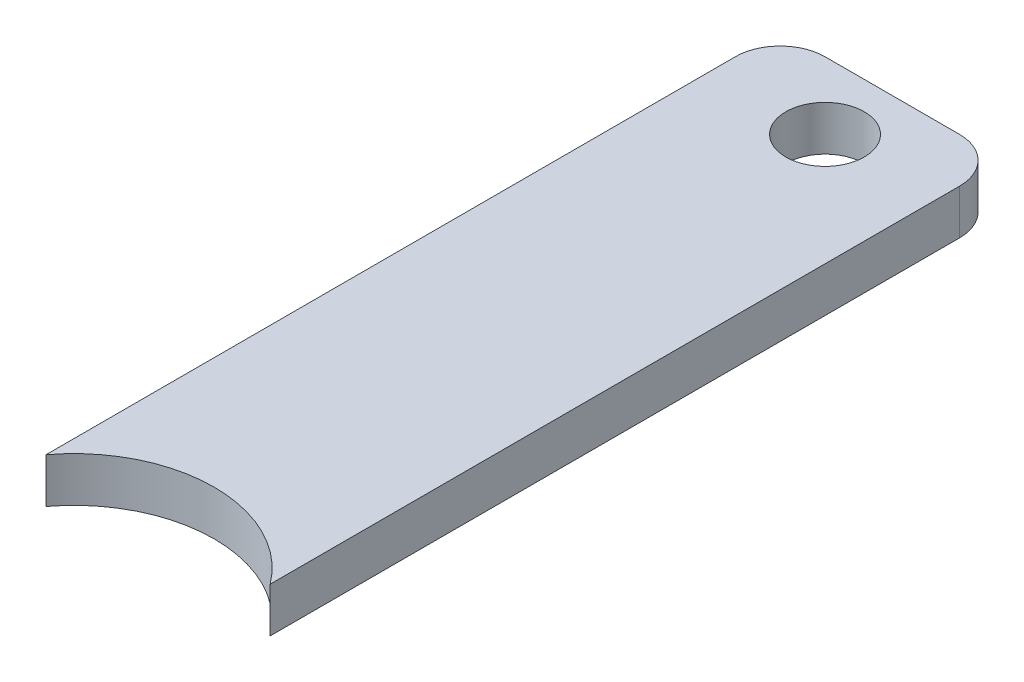
ISO-10303-21;
HEADER;
FILE_DESCRIPTION(('STEP AP214'),'2;1');
FILE_NAME('part.step','',(''),(''),'','','');
FILE_SCHEMA(('AUTOMOTIVE_DESIGN { 1 0 10303 214 1 1 1 1 }'));
ENDSEC;
DATA;
#1=APPLICATION_CONTEXT('core data for automotive mechanical design processes');
#2=APPLICATION_PROTOCOL_DEFINITION('international standard','automotive_design',2000,#1);
#3=PRODUCT_CONTEXT('',#1,'mechanical');
#4=PRODUCT('Part','Part','',(#3));
#5=PRODUCT_RELATED_PRODUCT_CATEGORY('part','',(#4));
#6=PRODUCT_DEFINITION_FORMATION('','',#4);
#7=PRODUCT_DEFINITION_CONTEXT('part definition',#1,'design');
#8=PRODUCT_DEFINITION('design','',#6,#7);
#9=PRODUCT_DEFINITION_SHAPE('','',#8);
#10=(LENGTH_UNIT() NAMED_UNIT(*) SI_UNIT(.MILLI.,.METRE.));
#11=(NAMED_UNIT(*) PLANE_ANGLE_UNIT() SI_UNIT($,.RADIAN.));
#12=(NAMED_UNIT(*) SI_UNIT($,.STERADIAN.) SOLID_ANGLE_UNIT());
#13=UNCERTAINTY_MEASURE_WITH_UNIT(LENGTH_MEASURE(1.E-05),#10,'distance_accuracy_value','');
#14=(GEOMETRIC_REPRESENTATION_CONTEXT(3) GLOBAL_UNCERTAINTY_ASSIGNED_CONTEXT((#13)) GLOBAL_UNIT_ASSIGNED_CONTEXT((#10,
#11,#12)) REPRESENTATION_CONTEXT('',''));
#15=CARTESIAN_POINT('',(0.,0.,0.));
#16=DIRECTION('',(0.,0.,1.));
#17=DIRECTION('',(1.,0.,0.));
#18=AXIS2_PLACEMENT_3D('',#15,#16,#17);
#19=CARTESIAN_POINT('',(5.99999999999856,4.,-76.0000000000018));
#20=DIRECTION('',(0.,1.,0.));
#21=DIRECTION('',(0.,0.,1.00000000000002));
#22=AXIS2_PLACEMENT_3D('',#19,#20,#21);
#23=PLANE('',#22);
#24=CARTESIAN_POINT('',(5.99999999999856,4.,-76.0000000000018));
#25=DIRECTION('',(0.,1.,0.));
#26=DIRECTION('',(0.,0.,1.00000000000002));
#27=AXIS2_PLACEMENT_3D('',#24,#25,#26);
#28=CIRCLE('',#27,4.00000000000001);
#29=CARTESIAN_POINT('',(9.99999999999876,4.,-76.0000000000019));
#30=VERTEX_POINT('',#29);
#31=CARTESIAN_POINT('',(5.99999999999881,4.,-80.000000000002));
#32=VERTEX_POINT('',#31);
#33=EDGE_CURVE('E142',#30,#32,#28,.T.);
#34=ORIENTED_EDGE('',*,*,#33,.T.);
#35=DIRECTION('',(-1.00000000000002,0.,0.));
#36=VECTOR('',#35,1.);
#37=CARTESIAN_POINT('',(5.99999999999881,4.,-80.000000000002));
#38=LINE('',#37,#36);
#39=CARTESIAN_POINT('',(-6.00000000000153,4.000000000005,-80.000000000002));
#40=VERTEX_POINT('',#39);
#41=EDGE_CURVE('E89',#32,#40,#38,.T.);
#42=ORIENTED_EDGE('',*,*,#41,.T.);
#43=CARTESIAN_POINT('',(-6.00000000000164,4.000000000005,-76.000000000002));
#44=DIRECTION('',(0.,1.,0.));
#45=DIRECTION('',(0.,0.,-1.00000000000002));
#46=AXIS2_PLACEMENT_3D('',#43,#44,#45);
#47=CIRCLE('',#46,3.99999999999999);
#48=CARTESIAN_POINT('',(-10.0000000000016,4.000000000005,-76.0000000000019));
#49=VERTEX_POINT('',#48);
#50=EDGE_CURVE('E102',#40,#49,#47,.T.);
#51=ORIENTED_EDGE('',*,*,#50,.T.);
#52=DIRECTION('',(0.,0.,1.00000000000002));
#53=VECTOR('',#52,1.);
#54=CARTESIAN_POINT('',(-10.0000000000003,4.,-14.5));
#55=LINE('',#54,#53);
#56=CARTESIAN_POINT('',(-10.0000000000003,4.,-14.5));
#57=VERTEX_POINT('',#56);
#58=EDGE_CURVE('E96',#49,#57,#55,.T.);
#59=ORIENTED_EDGE('',*,*,#58,.T.);
#60=CARTESIAN_POINT('',(-4.9960036108132E-13,3.99999999999889,-7.00000000000023));
#61=DIRECTION('',(0.,-1.,0.));
#62=DIRECTION('',(0.,0.,1.00000000000002));
#63=AXIS2_PLACEMENT_3D('',#60,#61,#62);
#64=CIRCLE('',#63,12.5);
#65=CARTESIAN_POINT('',(9.99999999999962,4.,-14.5000000000003));
#66=VERTEX_POINT('',#65);
#67=EDGE_CURVE('E100',#57,#66,#64,.T.);
#68=ORIENTED_EDGE('',*,*,#67,.T.);
#69=DIRECTION('',(0.,0.,-1.00000000000002));
#70=VECTOR('',#69,1.);
#71=CARTESIAN_POINT('',(9.99999999999962,4.,-14.5000000000003));
#72=LINE('',#71,#70);
#73=EDGE_CURVE('E52',#66,#30,#72,.T.);
#74=ORIENTED_EDGE('',*,*,#73,.T.);
#75=EDGE_LOOP('',(#34,#42,#51,#59,#68,#74));
#76=FACE_BOUND('',#75,.T.);
#77=CARTESIAN_POINT('',(-1.02695629777827E-12,4.000000000005,-74.0000000000014));
#78=DIRECTION('',(0.,1.,0.));
#79=DIRECTION('',(0.,0.,1.00000000000002));
#80=AXIS2_PLACEMENT_3D('',#77,#78,#79);
#81=CIRCLE('',#80,3.50000000000003);
#82=CARTESIAN_POINT('',(-1.02695629777827E-12,4.000000000005,-70.5000000000013));
#83=VERTEX_POINT('',#82);
#84=EDGE_CURVE('E130',#83,#83,#81,.T.);
#85=ORIENTED_EDGE('',*,*,#84,.F.);
#86=EDGE_LOOP('',(#85));
#87=FACE_BOUND('',#86,.T.);
#88=ADVANCED_FACE('F34',(#76,#87),#23,.T.);
#89=CARTESIAN_POINT('',(5.99999999999909,0.,-76.0000000000013));
#90=DIRECTION('',(0.,1.,0.));
#91=DIRECTION('',(0.,0.,1.00000000000002));
#92=AXIS2_PLACEMENT_3D('',#89,#90,#91);
#93=PLANE('',#92);
#94=CARTESIAN_POINT('',(5.99999999999909,0.,-76.0000000000013));
#95=DIRECTION('',(0.,1.,0.));
#96=DIRECTION('',(0.,0.,1.00000000000002));
#97=AXIS2_PLACEMENT_3D('',#94,#95,#96);
#98=CIRCLE('',#97,4.00000000000001);
#99=CARTESIAN_POINT('',(9.9999999999992,0.,-76.0000000000018));
#100=VERTEX_POINT('',#99);
#101=CARTESIAN_POINT('',(5.99999999999903,0.,-80.0000000000017));
#102=VERTEX_POINT('',#101);
#103=EDGE_CURVE('E125',#100,#102,#98,.T.);
#104=ORIENTED_EDGE('',*,*,#103,.F.);
#105=DIRECTION('',(0.,0.,-1.00000000000002));
#106=VECTOR('',#105,1.);
#107=CARTESIAN_POINT('',(9.99999999999979,0.,-14.5000000000001));
#108=LINE('',#107,#106);
#109=CARTESIAN_POINT('',(9.99999999999979,0.,-14.5000000000001));
#110=VERTEX_POINT('',#109);
#111=EDGE_CURVE('E81',#110,#100,#108,.T.);
#112=ORIENTED_EDGE('',*,*,#111,.F.);
#113=CARTESIAN_POINT('',(0.,-1.11022302462516E-12,-7.00000000000005));
#114=DIRECTION('',(0.,-1.,0.));
#115=DIRECTION('',(0.,0.,1.00000000000002));
#116=AXIS2_PLACEMENT_3D('',#113,#114,#115);
#117=CIRCLE('',#116,12.5);
#118=CARTESIAN_POINT('',(-10.0000000000004,0.,-14.5000000000004));
#119=VERTEX_POINT('',#118);
#120=EDGE_CURVE('E75',#119,#110,#117,.T.);
#121=ORIENTED_EDGE('',*,*,#120,.F.);
#122=DIRECTION('',(0.,0.,1.00000000000002));
#123=VECTOR('',#122,1.);
#124=CARTESIAN_POINT('',(-10.0000000000004,0.,-14.5000000000004));
#125=LINE('',#124,#123);
#126=CARTESIAN_POINT('',(-10.0000000000008,4.9960036108132E-12,-76.000000000001));
#127=VERTEX_POINT('',#126);
#128=EDGE_CURVE('E111',#127,#119,#125,.T.);
#129=ORIENTED_EDGE('',*,*,#128,.F.);
#130=CARTESIAN_POINT('',(-6.00000000000075,4.9960036108132E-12,-76.0000000000009));
#131=DIRECTION('',(0.,1.,0.));
#132=DIRECTION('',(0.,0.,-1.00000000000002));
#133=AXIS2_PLACEMENT_3D('',#130,#131,#132);
#134=CIRCLE('',#133,3.99999999999999);
#135=CARTESIAN_POINT('',(-6.00000000000075,4.9960036108132E-12,-80.0000000000011));
#136=VERTEX_POINT('',#135);
#137=EDGE_CURVE('E133',#136,#127,#134,.T.);
#138=ORIENTED_EDGE('',*,*,#137,.F.);
#139=DIRECTION('',(-1.00000000000002,0.,0.));
#140=VECTOR('',#139,1.);
#141=CARTESIAN_POINT('',(5.99999999999903,0.,-80.0000000000017));
#142=LINE('',#141,#140);
#143=EDGE_CURVE('E129',#102,#136,#142,.T.);
#144=ORIENTED_EDGE('',*,*,#143,.F.);
#145=EDGE_LOOP('',(#104,#112,#121,#129,#138,#144));
#146=FACE_BOUND('',#145,.T.);
#147=CARTESIAN_POINT('',(-5.82867087928207E-13,4.9960036108132E-12,-74.0000000000015));
#148=DIRECTION('',(0.,1.,0.));
#149=DIRECTION('',(0.,0.,1.00000000000002));
#150=AXIS2_PLACEMENT_3D('',#147,#148,#149);
#151=CIRCLE('',#150,3.50000000000003);
#152=CARTESIAN_POINT('',(-5.82867087928207E-13,4.9960036108132E-12,-70.5000000000014));
#153=VERTEX_POINT('',#152);
#154=EDGE_CURVE('E240',#153,#153,#151,.T.);
#155=ORIENTED_EDGE('',*,*,#154,.T.);
#156=EDGE_LOOP('',(#155));
#157=FACE_BOUND('',#156,.T.);
#158=ADVANCED_FACE('F156',(#146,#157),#93,.F.);
#159=CARTESIAN_POINT('',(5.99999999999856,4.,-76.0000000000018));
#160=DIRECTION('',(0.,-1.,0.));
#161=DIRECTION('',(0.,0.,-1.00000000000002));
#162=AXIS2_PLACEMENT_3D('',#159,#160,#161);
#163=CYLINDRICAL_SURFACE('',#162,4.00000000000001);
#164=ORIENTED_EDGE('',*,*,#103,.T.);
#165=DIRECTION('',(0.,-1.,0.));
#166=VECTOR('',#165,1.);
#167=CARTESIAN_POINT('',(5.99999999999881,4.,-80.000000000002));
#168=LINE('',#167,#166);
#169=EDGE_CURVE('E11',#32,#102,#168,.T.);
#170=ORIENTED_EDGE('',*,*,#169,.F.);
#171=ORIENTED_EDGE('',*,*,#33,.F.);
#172=DIRECTION('',(0.,-1.,0.));
#173=VECTOR('',#172,1.);
#174=CARTESIAN_POINT('',(9.99999999999876,4.,-76.0000000000019));
#175=LINE('',#174,#173);
#176=EDGE_CURVE('E121',#30,#100,#175,.T.);
#177=ORIENTED_EDGE('',*,*,#176,.T.);
#178=EDGE_LOOP('',(#164,#170,#171,#177));
#179=FACE_BOUND('',#178,.T.);
#180=ADVANCED_FACE('F36',(#179),#163,.T.);
#181=CARTESIAN_POINT('',(5.99999999999881,4.,-80.000000000002));
#182=DIRECTION('',(0.,0.,1.00000000000002));
#183=DIRECTION('',(1.00000000000002,0.,0.));
#184=AXIS2_PLACEMENT_3D('',#181,#182,#183);
#185=PLANE('',#184);
#186=ORIENTED_EDGE('',*,*,#143,.T.);
#187=DIRECTION('',(0.,-1.,0.));
#188=VECTOR('',#187,1.);
#189=CARTESIAN_POINT('',(-6.00000000000153,4.000000000005,-80.000000000002));
#190=LINE('',#189,#188);
#191=EDGE_CURVE('E44',#40,#136,#190,.T.);
#192=ORIENTED_EDGE('',*,*,#191,.F.);
#193=ORIENTED_EDGE('',*,*,#41,.F.);
#194=ORIENTED_EDGE('',*,*,#169,.T.);
#195=EDGE_LOOP('',(#186,#192,#193,#194));
#196=FACE_BOUND('',#195,.T.);
#197=ADVANCED_FACE('F181',(#196),#185,.F.);
#198=CARTESIAN_POINT('',(-6.00000000000164,4.000000000005,-76.000000000002));
#199=DIRECTION('',(0.,-1.,0.));
#200=DIRECTION('',(0.,0.,-1.00000000000002));
#201=AXIS2_PLACEMENT_3D('',#198,#199,#200);
#202=CYLINDRICAL_SURFACE('',#201,3.99999999999999);
#203=ORIENTED_EDGE('',*,*,#137,.T.);
#204=DIRECTION('',(0.,-1.,0.));
#205=VECTOR('',#204,1.);
#206=CARTESIAN_POINT('',(-10.0000000000016,4.000000000005,-76.0000000000019));
#207=LINE('',#206,#205);
#208=EDGE_CURVE('E113',#49,#127,#207,.T.);
#209=ORIENTED_EDGE('',*,*,#208,.F.);
#210=ORIENTED_EDGE('',*,*,#50,.F.);
#211=ORIENTED_EDGE('',*,*,#191,.T.);
#212=EDGE_LOOP('',(#203,#209,#210,#211));
#213=FACE_BOUND('',#212,.T.);
#214=ADVANCED_FACE('F153',(#213),#202,.T.);
#215=CARTESIAN_POINT('',(-10.0000000000003,4.,-14.5));
#216=DIRECTION('',(1.00000000000002,0.,0.));
#217=DIRECTION('',(0.,0.,-1.00000000000002));
#218=AXIS2_PLACEMENT_3D('',#215,#216,#217);
#219=PLANE('',#218);
#220=ORIENTED_EDGE('',*,*,#128,.T.);
#221=DIRECTION('',(0.,-1.,0.));
#222=VECTOR('',#221,1.);
#223=CARTESIAN_POINT('',(-10.0000000000003,4.,-14.5));
#224=LINE('',#223,#222);
#225=EDGE_CURVE('E108',#57,#119,#224,.T.);
#226=ORIENTED_EDGE('',*,*,#225,.F.);
#227=ORIENTED_EDGE('',*,*,#58,.F.);
#228=ORIENTED_EDGE('',*,*,#208,.T.);
#229=EDGE_LOOP('',(#220,#226,#227,#228));
#230=FACE_BOUND('',#229,.T.);
#231=ADVANCED_FACE('F109',(#230),#219,.F.);
#232=CARTESIAN_POINT('',(-4.9960036108132E-13,3.99999999999889,-7.00000000000023));
#233=DIRECTION('',(0.,-1.,0.));
#234=DIRECTION('',(0.,0.,-1.00000000000002));
#235=AXIS2_PLACEMENT_3D('',#232,#233,#234);
#236=CYLINDRICAL_SURFACE('',#235,12.5);
#237=ORIENTED_EDGE('',*,*,#120,.T.);
#238=DIRECTION('',(0.,-1.,0.));
#239=VECTOR('',#238,1.);
#240=CARTESIAN_POINT('',(9.99999999999962,4.,-14.5000000000003));
#241=LINE('',#240,#239);
#242=EDGE_CURVE('E114',#66,#110,#241,.T.);
#243=ORIENTED_EDGE('',*,*,#242,.F.);
#244=ORIENTED_EDGE('',*,*,#67,.F.);
#245=ORIENTED_EDGE('',*,*,#225,.T.);
#246=EDGE_LOOP('',(#237,#243,#244,#245));
#247=FACE_BOUND('',#246,.T.);
#248=ADVANCED_FACE('F116',(#247),#236,.F.);
#249=CARTESIAN_POINT('',(9.99999999999962,4.,-14.5000000000003));
#250=DIRECTION('',(-1.00000000000002,0.,0.));
#251=DIRECTION('',(0.,0.,1.00000000000002));
#252=AXIS2_PLACEMENT_3D('',#249,#250,#251);
#253=PLANE('',#252);
#254=ORIENTED_EDGE('',*,*,#111,.T.);
#255=ORIENTED_EDGE('',*,*,#176,.F.);
#256=ORIENTED_EDGE('',*,*,#73,.F.);
#257=ORIENTED_EDGE('',*,*,#242,.T.);
#258=EDGE_LOOP('',(#254,#255,#256,#257));
#259=FACE_BOUND('',#258,.T.);
#260=ADVANCED_FACE('F161',(#259),#253,.F.);
#261=CARTESIAN_POINT('',(-1.02695629777827E-12,4.000000000005,-74.0000000000014));
#262=DIRECTION('',(0.,-1.,0.));
#263=DIRECTION('',(0.,0.,-1.00000000000002));
#264=AXIS2_PLACEMENT_3D('',#261,#262,#263);
#265=CYLINDRICAL_SURFACE('',#264,3.50000000000003);
#266=ORIENTED_EDGE('',*,*,#84,.T.);
#267=EDGE_LOOP('',(#266));
#268=FACE_BOUND('',#267,.T.);
#269=ORIENTED_EDGE('',*,*,#154,.F.);
#270=EDGE_LOOP('',(#269));
#271=FACE_BOUND('',#270,.T.);
#272=ADVANCED_FACE('F163',(#268,#271),#265,.F.);
#273=CLOSED_SHELL('',(#88,#158,#180,#197,#214,#231,#248,#260,#272));
#274=MANIFOLD_SOLID_BREP('B2',#273);
#275=ADVANCED_BREP_SHAPE_REPRESENTATION('',(#18,#274),#14);
#276=SHAPE_DEFINITION_REPRESENTATION(#9,#275);
ENDSEC;
END-ISO-10303-21;
